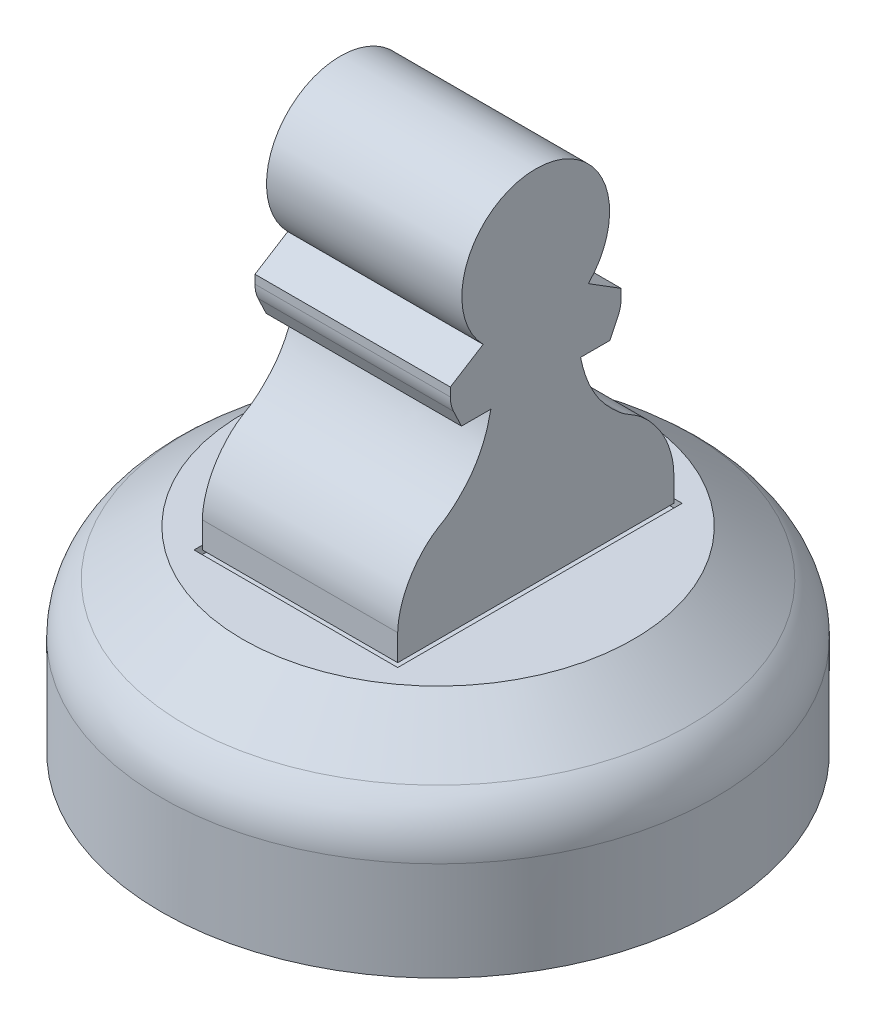
ISO-10303-21;
HEADER;
FILE_DESCRIPTION(('STEP AP214'),'2;1');
FILE_NAME('part.step','',(''),(''),'','','');
FILE_SCHEMA(('AUTOMOTIVE_DESIGN { 1 0 10303 214 1 1 1 1 }'));
ENDSEC;
DATA;
#1=APPLICATION_CONTEXT('core data for automotive mechanical design processes');
#2=APPLICATION_PROTOCOL_DEFINITION('international standard','automotive_design',2000,#1);
#3=PRODUCT_CONTEXT('',#1,'mechanical');
#4=PRODUCT('Part','Part','',(#3));
#5=PRODUCT_RELATED_PRODUCT_CATEGORY('part','',(#4));
#6=PRODUCT_DEFINITION_FORMATION('','',#4);
#7=PRODUCT_DEFINITION_CONTEXT('part definition',#1,'design');
#8=PRODUCT_DEFINITION('design','',#6,#7);
#9=PRODUCT_DEFINITION_SHAPE('','',#8);
#10=(LENGTH_UNIT() NAMED_UNIT(*) SI_UNIT(.MILLI.,.METRE.));
#11=(NAMED_UNIT(*) PLANE_ANGLE_UNIT() SI_UNIT($,.RADIAN.));
#12=(NAMED_UNIT(*) SI_UNIT($,.STERADIAN.) SOLID_ANGLE_UNIT());
#13=UNCERTAINTY_MEASURE_WITH_UNIT(LENGTH_MEASURE(1.E-05),#10,'distance_accuracy_value','');
#14=(GEOMETRIC_REPRESENTATION_CONTEXT(3) GLOBAL_UNCERTAINTY_ASSIGNED_CONTEXT((#13)) GLOBAL_UNIT_ASSIGNED_CONTEXT((#10,
#11,#12)) REPRESENTATION_CONTEXT('',''));
#15=CARTESIAN_POINT('',(0.,0.,0.));
#16=DIRECTION('',(0.,0.,1.));
#17=DIRECTION('',(1.,0.,0.));
#18=AXIS2_PLACEMENT_3D('',#15,#16,#17);
#19=CARTESIAN_POINT('',(4.7625,9.525,6.731));
#20=DIRECTION('',(0.,0.,-1.));
#21=DIRECTION('',(-1.,0.,0.));
#22=AXIS2_PLACEMENT_3D('',#19,#20,#21);
#23=PLANE('',#22);
#24=DIRECTION('',(0.,-1.,0.));
#25=VECTOR('',#24,1.);
#26=CARTESIAN_POINT('',(-4.7625,9.525,6.731));
#27=LINE('',#26,#25);
#28=CARTESIAN_POINT('',(-4.7625,10.795,6.731));
#29=VERTEX_POINT('',#28);
#30=CARTESIAN_POINT('',(-4.7625,9.525,6.731));
#31=VERTEX_POINT('',#30);
#32=EDGE_CURVE('E183',#29,#31,#27,.T.);
#33=ORIENTED_EDGE('',*,*,#32,.T.);
#34=DIRECTION('',(-1.,0.,0.));
#35=VECTOR('',#34,1.);
#36=CARTESIAN_POINT('',(4.7625,9.525,6.731));
#37=LINE('',#36,#35);
#38=CARTESIAN_POINT('',(4.7625,9.525,6.731));
#39=VERTEX_POINT('',#38);
#40=EDGE_CURVE('E164',#39,#31,#37,.T.);
#41=ORIENTED_EDGE('',*,*,#40,.F.);
#42=DIRECTION('',(0.,-1.,0.));
#43=VECTOR('',#42,1.);
#44=CARTESIAN_POINT('',(4.7625,9.525,6.731));
#45=LINE('',#44,#43);
#46=CARTESIAN_POINT('',(4.7625,10.795,6.731));
#47=VERTEX_POINT('',#46);
#48=EDGE_CURVE('E170',#47,#39,#45,.T.);
#49=ORIENTED_EDGE('',*,*,#48,.F.);
#50=DIRECTION('',(-1.,0.,0.));
#51=VECTOR('',#50,1.);
#52=CARTESIAN_POINT('',(4.7625,10.795,6.731));
#53=LINE('',#52,#51);
#54=EDGE_CURVE('E227',#47,#29,#53,.T.);
#55=ORIENTED_EDGE('',*,*,#54,.T.);
#56=EDGE_LOOP('',(#33,#41,#49,#55));
#57=FACE_BOUND('',#56,.T.);
#58=ADVANCED_FACE('F47',(#57),#23,.F.);
#59=CARTESIAN_POINT('',(4.7625,9.525,6.731));
#60=DIRECTION('',(0.,1.,0.));
#61=DIRECTION('',(0.,0.,1.));
#62=AXIS2_PLACEMENT_3D('',#59,#60,#61);
#63=PLANE('',#62);
#64=DIRECTION('',(0.,0.,-1.));
#65=VECTOR('',#64,1.);
#66=CARTESIAN_POINT('',(-4.7625,9.525,6.731));
#67=LINE('',#66,#65);
#68=CARTESIAN_POINT('',(-4.7625,9.525,-6.731));
#69=VERTEX_POINT('',#68);
#70=EDGE_CURVE('E272',#31,#69,#67,.T.);
#71=ORIENTED_EDGE('',*,*,#70,.T.);
#72=DIRECTION('',(-1.,0.,0.));
#73=VECTOR('',#72,1.);
#74=CARTESIAN_POINT('',(4.7625,9.525,-6.731));
#75=LINE('',#74,#73);
#76=CARTESIAN_POINT('',(4.7625,9.525,-6.731));
#77=VERTEX_POINT('',#76);
#78=EDGE_CURVE('E167',#77,#69,#75,.T.);
#79=ORIENTED_EDGE('',*,*,#78,.F.);
#80=DIRECTION('',(0.,0.,-1.));
#81=VECTOR('',#80,1.);
#82=CARTESIAN_POINT('',(4.7625,9.525,6.731));
#83=LINE('',#82,#81);
#84=EDGE_CURVE('E160',#39,#77,#83,.T.);
#85=ORIENTED_EDGE('',*,*,#84,.F.);
#86=ORIENTED_EDGE('',*,*,#40,.T.);
#87=EDGE_LOOP('',(#71,#79,#85,#86));
#88=FACE_BOUND('',#87,.T.);
#89=ADVANCED_FACE('F162',(#88),#63,.F.);
#90=CARTESIAN_POINT('',(4.7625,9.525,-6.731));
#91=DIRECTION('',(0.,0.,1.));
#92=DIRECTION('',(1.,0.,0.));
#93=AXIS2_PLACEMENT_3D('',#90,#91,#92);
#94=PLANE('',#93);
#95=DIRECTION('',(0.,1.,0.));
#96=VECTOR('',#95,1.);
#97=CARTESIAN_POINT('',(-4.7625,9.525,-6.731));
#98=LINE('',#97,#96);
#99=CARTESIAN_POINT('',(-4.7625,10.795,-6.731));
#100=VERTEX_POINT('',#99);
#101=EDGE_CURVE('E266',#69,#100,#98,.T.);
#102=ORIENTED_EDGE('',*,*,#101,.T.);
#103=DIRECTION('',(-1.,0.,0.));
#104=VECTOR('',#103,1.);
#105=CARTESIAN_POINT('',(4.7625,10.795,-6.731));
#106=LINE('',#105,#104);
#107=CARTESIAN_POINT('',(4.7625,10.795,-6.731));
#108=VERTEX_POINT('',#107);
#109=EDGE_CURVE('E189',#108,#100,#106,.T.);
#110=ORIENTED_EDGE('',*,*,#109,.F.);
#111=DIRECTION('',(0.,1.,0.));
#112=VECTOR('',#111,1.);
#113=CARTESIAN_POINT('',(4.7625,9.525,-6.731));
#114=LINE('',#113,#112);
#115=EDGE_CURVE('E169',#77,#108,#114,.T.);
#116=ORIENTED_EDGE('',*,*,#115,.F.);
#117=ORIENTED_EDGE('',*,*,#78,.T.);
#118=EDGE_LOOP('',(#102,#110,#116,#117));
#119=FACE_BOUND('',#118,.T.);
#120=ADVANCED_FACE('F353',(#119),#94,.F.);
#121=CARTESIAN_POINT('',(4.7625,10.795,-6.731));
#122=CARTESIAN_POINT('',(4.7625,11.0241319268793,-6.731));
#123=CARTESIAN_POINT('',(4.7625,11.6026874611906,-6.64960612664507));
#124=CARTESIAN_POINT('',(4.7625,12.4706472582263,-6.35813117453108));
#125=CARTESIAN_POINT('',(4.7625,13.3301451794058,-5.80840860481326));
#126=CARTESIAN_POINT('',(4.7625,13.9301633771704,-5.23255324055301));
#127=CARTESIAN_POINT('',(4.7625,14.2671935066349,-4.73562192455966));
#128=CARTESIAN_POINT('',(4.7625,14.4669731061236,-4.36587594436598));
#129=CARTESIAN_POINT('',(4.7625,14.7635423092739,-3.99120816735));
#130=CARTESIAN_POINT('',(4.7625,15.1524052456358,-3.58560832337421));
#131=CARTESIAN_POINT('',(4.7625,15.6210459586736,-3.16772687320739));
#132=CARTESIAN_POINT('',(4.7625,16.138033377056,-2.83552458023219));
#133=CARTESIAN_POINT('',(4.7625,16.9097644676274,-2.44918747956017));
#134=CARTESIAN_POINT('',(4.7625,17.5317353579022,-2.2731838727057));
#135=CARTESIAN_POINT('',(4.7625,17.959882493164,-2.18521627206356));
#136=B_SPLINE_CURVE_WITH_KNOTS('',3,(#121,#122,#123,#124,#125,#126,#127,#128,#129,#130,#131,
#132,#133,#134,#135),.UNSPECIFIED.,.F.,.F.,(4,1,1,1,1,1,1,1,1,1,1,1,4),(0.,0.0781794203305404,
0.198071140705867,0.30964197025263,0.424067637434609,0.479109807675531,0.514035466320368,
0.567359704278794,0.641472424946778,0.705863071006986,0.781200871805529,0.850497950222123,1.),.UNSPECIFIED.);
#137=DIRECTION('',(-1.,0.,0.));
#138=VECTOR('',#137,1.);
#139=SURFACE_OF_LINEAR_EXTRUSION('',#136,#138);
#140=CARTESIAN_POINT('',(-4.7625,10.795,-6.731));
#141=CARTESIAN_POINT('',(-4.7625,11.0241319268793,-6.731));
#142=CARTESIAN_POINT('',(-4.7625,11.6026874611906,-6.64960612664507));
#143=CARTESIAN_POINT('',(-4.7625,12.4706472582263,-6.35813117453108));
#144=CARTESIAN_POINT('',(-4.7625,13.3301451794058,-5.80840860481326));
#145=CARTESIAN_POINT('',(-4.7625,13.9301633771704,-5.23255324055301));
#146=CARTESIAN_POINT('',(-4.7625,14.2671935066349,-4.73562192455966));
#147=CARTESIAN_POINT('',(-4.7625,14.4669731061236,-4.36587594436598));
#148=CARTESIAN_POINT('',(-4.7625,14.7635423092739,-3.99120816735));
#149=CARTESIAN_POINT('',(-4.7625,15.1524052456358,-3.58560832337421));
#150=CARTESIAN_POINT('',(-4.7625,15.6210459586736,-3.16772687320739));
#151=CARTESIAN_POINT('',(-4.7625,16.138033377056,-2.83552458023219));
#152=CARTESIAN_POINT('',(-4.7625,16.9097644676274,-2.44918747956017));
#153=CARTESIAN_POINT('',(-4.7625,17.5317353579022,-2.2731838727057));
#154=CARTESIAN_POINT('',(-4.7625,17.959882493164,-2.18521627206356));
#155=B_SPLINE_CURVE_WITH_KNOTS('',3,(#140,#141,#142,#143,#144,#145,#146,#147,#148,#149,#150,
#151,#152,#153,#154),.UNSPECIFIED.,.F.,.F.,(4,1,1,1,1,1,1,1,1,1,1,1,4),(0.,0.0781794203305404,
0.198071140705867,0.30964197025263,0.424067637434609,0.479109807675531,0.514035466320368,
0.567359704278794,0.641472424946778,0.705863071006986,0.781200871805529,0.850497950222123,1.),.UNSPECIFIED.);
#156=CARTESIAN_POINT('',(-4.7625,17.959882493164,-2.18521627206356));
#157=VERTEX_POINT('',#156);
#158=EDGE_CURVE('E261',#100,#157,#155,.T.);
#159=ORIENTED_EDGE('',*,*,#158,.T.);
#160=DIRECTION('',(-1.,0.,0.));
#161=VECTOR('',#160,1.);
#162=CARTESIAN_POINT('',(4.7625,17.959882493164,-2.18521627206356));
#163=LINE('',#162,#161);
#164=CARTESIAN_POINT('',(4.7625,17.959882493164,-2.18521627206356));
#165=VERTEX_POINT('',#164);
#166=EDGE_CURVE('E252',#165,#157,#163,.T.);
#167=ORIENTED_EDGE('',*,*,#166,.F.);
#168=EDGE_CURVE('E262',#108,#165,#136,.T.);
#169=ORIENTED_EDGE('',*,*,#168,.F.);
#170=ORIENTED_EDGE('',*,*,#109,.T.);
#171=EDGE_LOOP('',(#159,#167,#169,#170));
#172=FACE_BOUND('',#171,.T.);
#173=ADVANCED_FACE('F259',(#172),#139,.F.);
#174=CARTESIAN_POINT('',(4.7625,17.959882493164,-2.18521627206356));
#175=DIRECTION('',(0.,1.,0.));
#176=DIRECTION('',(0.,0.,1.));
#177=AXIS2_PLACEMENT_3D('',#174,#175,#176);
#178=PLANE('',#177);
#179=DIRECTION('',(0.,0.,-1.));
#180=VECTOR('',#179,1.);
#181=CARTESIAN_POINT('',(-4.7625,17.959882493164,-2.18521627206356));
#182=LINE('',#181,#180);
#183=CARTESIAN_POINT('',(-4.7625,17.959882493164,-3.6207595466449));
#184=VERTEX_POINT('',#183);
#185=EDGE_CURVE('E268',#157,#184,#182,.T.);
#186=ORIENTED_EDGE('',*,*,#185,.T.);
#187=DIRECTION('',(-1.,0.,0.));
#188=VECTOR('',#187,1.);
#189=CARTESIAN_POINT('',(4.7625,17.959882493164,-3.6207595466449));
#190=LINE('',#189,#188);
#191=CARTESIAN_POINT('',(4.7625,17.959882493164,-3.6207595466449));
#192=VERTEX_POINT('',#191);
#193=EDGE_CURVE('E249',#192,#184,#190,.T.);
#194=ORIENTED_EDGE('',*,*,#193,.F.);
#195=DIRECTION('',(0.,0.,-1.));
#196=VECTOR('',#195,1.);
#197=CARTESIAN_POINT('',(4.7625,17.959882493164,-2.18521627206356));
#198=LINE('',#197,#196);
#199=EDGE_CURVE('E360',#165,#192,#198,.T.);
#200=ORIENTED_EDGE('',*,*,#199,.F.);
#201=ORIENTED_EDGE('',*,*,#166,.T.);
#202=EDGE_LOOP('',(#186,#194,#200,#201));
#203=FACE_BOUND('',#202,.T.);
#204=ADVANCED_FACE('F345',(#203),#178,.F.);
#205=CARTESIAN_POINT('',(4.7625,17.959882493164,-3.6207595466449));
#206=DIRECTION('',(0.,0.428528572308294,0.90352823017071));
#207=DIRECTION('',(0.,-0.90352823017071,0.428528572308294));
#208=AXIS2_PLACEMENT_3D('',#205,#206,#207);
#209=PLANE('',#208);
#210=DIRECTION('',(0.,0.90352823017071,-0.428528572308294));
#211=VECTOR('',#210,1.);
#212=CARTESIAN_POINT('',(-4.7625,17.959882493164,-3.6207595466449));
#213=LINE('',#212,#211);
#214=CARTESIAN_POINT('',(-4.7625,18.7839681348446,-4.01160980643419));
#215=VERTEX_POINT('',#214);
#216=EDGE_CURVE('E270',#184,#215,#213,.T.);
#217=ORIENTED_EDGE('',*,*,#216,.T.);
#218=DIRECTION('',(-1.,0.,0.));
#219=VECTOR('',#218,1.);
#220=CARTESIAN_POINT('',(4.7625,18.7839681348446,-4.01160980643419));
#221=LINE('',#220,#219);
#222=CARTESIAN_POINT('',(4.7625,18.7839681348446,-4.01160980643419));
#223=VERTEX_POINT('',#222);
#224=EDGE_CURVE('E196',#215,#223,#221,.F.);
#225=ORIENTED_EDGE('',*,*,#224,.T.);
#226=DIRECTION('',(0.,0.90352823017071,-0.428528572308294));
#227=VECTOR('',#226,1.);
#228=CARTESIAN_POINT('',(4.7625,17.959882493164,-3.6207595466449));
#229=LINE('',#228,#227);
#230=EDGE_CURVE('E365',#192,#223,#229,.T.);
#231=ORIENTED_EDGE('',*,*,#230,.F.);
#232=ORIENTED_EDGE('',*,*,#193,.T.);
#233=EDGE_LOOP('',(#217,#225,#231,#232));
#234=FACE_BOUND('',#233,.T.);
#235=ADVANCED_FACE('F341',(#234),#209,.F.);
#236=CARTESIAN_POINT('',(4.7625,19.1068739917165,-4.16475874103819));
#237=DIRECTION('',(0.,0.,1.));
#238=DIRECTION('',(1.,0.,0.));
#239=AXIS2_PLACEMENT_3D('',#236,#237,#238);
#240=PLANE('',#239);
#241=DIRECTION('',(0.,1.,0.));
#242=VECTOR('',#241,1.);
#243=CARTESIAN_POINT('',(4.7625,19.1068739917165,-4.16475874103819));
#244=LINE('',#243,#242);
#245=CARTESIAN_POINT('',(4.7625,19.4642572433841,-4.16475874103819));
#246=VERTEX_POINT('',#245);
#247=CARTESIAN_POINT('',(4.7625,19.8840341814102,-4.16475874103819));
#248=VERTEX_POINT('',#247);
#249=EDGE_CURVE('E367',#246,#248,#244,.T.);
#250=ORIENTED_EDGE('',*,*,#249,.F.);
#251=DIRECTION('',(-1.,0.,0.));
#252=VECTOR('',#251,1.);
#253=CARTESIAN_POINT('',(4.7625,19.4642572433841,-4.16475874103819));
#254=LINE('',#253,#252);
#255=CARTESIAN_POINT('',(-4.7625,19.4642572433841,-4.16475874103819));
#256=VERTEX_POINT('',#255);
#257=EDGE_CURVE('E184',#246,#256,#254,.T.);
#258=ORIENTED_EDGE('',*,*,#257,.T.);
#259=DIRECTION('',(0.,1.,0.));
#260=VECTOR('',#259,1.);
#261=CARTESIAN_POINT('',(-4.7625,19.1068739917165,-4.16475874103819));
#262=LINE('',#261,#260);
#263=CARTESIAN_POINT('',(-4.7625,19.8840341814102,-4.16475874103819));
#264=VERTEX_POINT('',#263);
#265=EDGE_CURVE('E283',#256,#264,#262,.T.);
#266=ORIENTED_EDGE('',*,*,#265,.T.);
#267=DIRECTION('',(-1.,0.,0.));
#268=VECTOR('',#267,1.);
#269=CARTESIAN_POINT('',(4.7625,19.8840341814102,-4.16475874103819));
#270=LINE('',#269,#268);
#271=EDGE_CURVE('E246',#248,#264,#270,.T.);
#272=ORIENTED_EDGE('',*,*,#271,.F.);
#273=EDGE_LOOP('',(#250,#258,#266,#272));
#274=FACE_BOUND('',#273,.T.);
#275=ADVANCED_FACE('F337',(#274),#240,.F.);
#276=CARTESIAN_POINT('',(4.7625,19.8840341814102,-4.16475874103819));
#277=DIRECTION('',(0.,-0.847610316453785,0.530619215107326));
#278=DIRECTION('',(0.,-0.530619215107326,-0.847610316453785));
#279=AXIS2_PLACEMENT_3D('',#276,#277,#278);
#280=PLANE('',#279);
#281=DIRECTION('',(0.,0.530619215107325,0.847610316453785));
#282=VECTOR('',#281,1.);
#283=CARTESIAN_POINT('',(-4.7625,19.8840341814102,-4.16475874103819));
#284=LINE('',#283,#282);
#285=CARTESIAN_POINT('',(-4.7625,20.8850698421642,-2.56570591928617));
#286=VERTEX_POINT('',#285);
#287=EDGE_CURVE('E285',#264,#286,#284,.T.);
#288=ORIENTED_EDGE('',*,*,#287,.T.);
#289=DIRECTION('',(-1.,0.,0.));
#290=VECTOR('',#289,1.);
#291=CARTESIAN_POINT('',(4.7625,20.8850698421642,-2.56570591928617));
#292=LINE('',#291,#290);
#293=CARTESIAN_POINT('',(4.7625,20.8850698421642,-2.56570591928617));
#294=VERTEX_POINT('',#293);
#295=EDGE_CURVE('E243',#294,#286,#292,.T.);
#296=ORIENTED_EDGE('',*,*,#295,.F.);
#297=DIRECTION('',(0.,0.530619215107325,0.847610316453785));
#298=VECTOR('',#297,1.);
#299=CARTESIAN_POINT('',(4.7625,19.8840341814102,-4.16475874103819));
#300=LINE('',#299,#298);
#301=EDGE_CURVE('E369',#248,#294,#300,.T.);
#302=ORIENTED_EDGE('',*,*,#301,.F.);
#303=ORIENTED_EDGE('',*,*,#271,.T.);
#304=EDGE_LOOP('',(#288,#296,#302,#303));
#305=FACE_BOUND('',#304,.T.);
#306=ADVANCED_FACE('F333',(#305),#280,.F.);
#307=CARTESIAN_POINT('',(4.7625,23.4136449680045,0.));
#308=DIRECTION('',(-1.,0.,0.));
#309=DIRECTION('',(0.,0.,1.));
#310=AXIS2_PLACEMENT_3D('',#307,#308,#309);
#311=CYLINDRICAL_SURFACE('',#310,3.60229635528204);
#312=CARTESIAN_POINT('',(-4.7625,23.4136449680045,0.));
#313=DIRECTION('',(1.,0.,0.));
#314=DIRECTION('',(0.,0.,1.));
#315=AXIS2_PLACEMENT_3D('',#312,#313,#314);
#316=CIRCLE('',#315,3.60229635528204);
#317=CARTESIAN_POINT('',(-4.7625,20.8850698421642,2.56570591928617));
#318=VERTEX_POINT('',#317);
#319=EDGE_CURVE('E287',#286,#318,#316,.T.);
#320=ORIENTED_EDGE('',*,*,#319,.T.);
#321=DIRECTION('',(-1.,0.,0.));
#322=VECTOR('',#321,1.);
#323=CARTESIAN_POINT('',(4.7625,20.8850698421642,2.56570591928617));
#324=LINE('',#323,#322);
#325=CARTESIAN_POINT('',(4.7625,20.8850698421642,2.56570591928617));
#326=VERTEX_POINT('',#325);
#327=EDGE_CURVE('E240',#326,#318,#324,.T.);
#328=ORIENTED_EDGE('',*,*,#327,.F.);
#329=CARTESIAN_POINT('',(4.7625,23.4136449680045,0.));
#330=DIRECTION('',(1.,0.,0.));
#331=DIRECTION('',(0.,0.,1.));
#332=AXIS2_PLACEMENT_3D('',#329,#330,#331);
#333=CIRCLE('',#332,3.60229635528204);
#334=EDGE_CURVE('E301',#294,#326,#333,.T.);
#335=ORIENTED_EDGE('',*,*,#334,.F.);
#336=ORIENTED_EDGE('',*,*,#295,.T.);
#337=EDGE_LOOP('',(#320,#328,#335,#336));
#338=FACE_BOUND('',#337,.T.);
#339=ADVANCED_FACE('F330',(#338),#311,.T.);
#340=CARTESIAN_POINT('',(4.7625,19.8840341814102,4.16475874103819));
#341=DIRECTION('',(0.,-0.847610316453785,-0.530619215107326));
#342=DIRECTION('',(0.,0.530619215107326,-0.847610316453785));
#343=AXIS2_PLACEMENT_3D('',#340,#341,#342);
#344=PLANE('',#343);
#345=DIRECTION('',(0.,-0.530619215107325,0.847610316453785));
#346=VECTOR('',#345,1.);
#347=CARTESIAN_POINT('',(-4.7625,19.8840341814102,4.16475874103819));
#348=LINE('',#347,#346);
#349=CARTESIAN_POINT('',(-4.7625,19.8840341814102,4.16475874103819));
#350=VERTEX_POINT('',#349);
#351=EDGE_CURVE('E220',#318,#350,#348,.T.);
#352=ORIENTED_EDGE('',*,*,#351,.T.);
#353=DIRECTION('',(-1.,0.,0.));
#354=VECTOR('',#353,1.);
#355=CARTESIAN_POINT('',(4.7625,19.8840341814102,4.16475874103819));
#356=LINE('',#355,#354);
#357=CARTESIAN_POINT('',(4.7625,19.8840341814102,4.16475874103819));
#358=VERTEX_POINT('',#357);
#359=EDGE_CURVE('E237',#358,#350,#356,.T.);
#360=ORIENTED_EDGE('',*,*,#359,.F.);
#361=DIRECTION('',(0.,-0.530619215107325,0.847610316453785));
#362=VECTOR('',#361,1.);
#363=CARTESIAN_POINT('',(4.7625,19.8840341814102,4.16475874103819));
#364=LINE('',#363,#362);
#365=EDGE_CURVE('E297',#326,#358,#364,.T.);
#366=ORIENTED_EDGE('',*,*,#365,.F.);
#367=ORIENTED_EDGE('',*,*,#327,.T.);
#368=EDGE_LOOP('',(#352,#360,#366,#367));
#369=FACE_BOUND('',#368,.T.);
#370=ADVANCED_FACE('F291',(#369),#344,.F.);
#371=CARTESIAN_POINT('',(4.7625,19.1068739917165,4.16475874103819));
#372=DIRECTION('',(0.,0.,-1.));
#373=DIRECTION('',(-1.,0.,0.));
#374=AXIS2_PLACEMENT_3D('',#371,#372,#373);
#375=PLANE('',#374);
#376=DIRECTION('',(0.,-1.,0.));
#377=VECTOR('',#376,1.);
#378=CARTESIAN_POINT('',(-4.7625,19.1068739917165,4.16475874103819));
#379=LINE('',#378,#377);
#380=CARTESIAN_POINT('',(-4.7625,19.4642572433841,4.16475874103819));
#381=VERTEX_POINT('',#380);
#382=EDGE_CURVE('E217',#350,#381,#379,.T.);
#383=ORIENTED_EDGE('',*,*,#382,.T.);
#384=DIRECTION('',(-1.,0.,0.));
#385=VECTOR('',#384,1.);
#386=CARTESIAN_POINT('',(4.7625,19.4642572433841,4.16475874103819));
#387=LINE('',#386,#385);
#388=CARTESIAN_POINT('',(4.7625,19.4642572433841,4.16475874103819));
#389=VERTEX_POINT('',#388);
#390=EDGE_CURVE('E12',#381,#389,#387,.F.);
#391=ORIENTED_EDGE('',*,*,#390,.T.);
#392=DIRECTION('',(0.,-1.,0.));
#393=VECTOR('',#392,1.);
#394=CARTESIAN_POINT('',(4.7625,19.1068739917165,4.16475874103819));
#395=LINE('',#394,#393);
#396=EDGE_CURVE('E296',#358,#389,#395,.T.);
#397=ORIENTED_EDGE('',*,*,#396,.F.);
#398=ORIENTED_EDGE('',*,*,#359,.T.);
#399=EDGE_LOOP('',(#383,#391,#397,#398));
#400=FACE_BOUND('',#399,.T.);
#401=ADVANCED_FACE('F295',(#400),#375,.F.);
#402=CARTESIAN_POINT('',(4.7625,17.959882493164,3.6207595466449));
#403=DIRECTION('',(0.,0.428528572308294,-0.90352823017071));
#404=DIRECTION('',(0.,0.90352823017071,0.428528572308294));
#405=AXIS2_PLACEMENT_3D('',#402,#403,#404);
#406=PLANE('',#405);
#407=DIRECTION('',(0.,-0.90352823017071,-0.428528572308294));
#408=VECTOR('',#407,1.);
#409=CARTESIAN_POINT('',(4.7625,17.959882493164,3.6207595466449));
#410=LINE('',#409,#408);
#411=CARTESIAN_POINT('',(4.7625,18.7839681348446,4.01160980643419));
#412=VERTEX_POINT('',#411);
#413=CARTESIAN_POINT('',(4.7625,17.959882493164,3.6207595466449));
#414=VERTEX_POINT('',#413);
#415=EDGE_CURVE('E208',#412,#414,#410,.T.);
#416=ORIENTED_EDGE('',*,*,#415,.F.);
#417=DIRECTION('',(-1.,0.,0.));
#418=VECTOR('',#417,1.);
#419=CARTESIAN_POINT('',(4.7625,18.7839681348446,4.01160980643419));
#420=LINE('',#419,#418);
#421=CARTESIAN_POINT('',(-4.7625,18.7839681348446,4.01160980643419));
#422=VERTEX_POINT('',#421);
#423=EDGE_CURVE('E55',#412,#422,#420,.T.);
#424=ORIENTED_EDGE('',*,*,#423,.T.);
#425=DIRECTION('',(0.,-0.90352823017071,-0.428528572308294));
#426=VECTOR('',#425,1.);
#427=CARTESIAN_POINT('',(-4.7625,17.959882493164,3.6207595466449));
#428=LINE('',#427,#426);
#429=CARTESIAN_POINT('',(-4.7625,17.959882493164,3.6207595466449));
#430=VERTEX_POINT('',#429);
#431=EDGE_CURVE('E206',#422,#430,#428,.T.);
#432=ORIENTED_EDGE('',*,*,#431,.T.);
#433=DIRECTION('',(-1.,0.,0.));
#434=VECTOR('',#433,1.);
#435=CARTESIAN_POINT('',(4.7625,17.959882493164,3.6207595466449));
#436=LINE('',#435,#434);
#437=EDGE_CURVE('E235',#414,#430,#436,.T.);
#438=ORIENTED_EDGE('',*,*,#437,.F.);
#439=EDGE_LOOP('',(#416,#424,#432,#438));
#440=FACE_BOUND('',#439,.T.);
#441=ADVANCED_FACE('F204',(#440),#406,.F.);
#442=CARTESIAN_POINT('',(4.7625,17.959882493164,2.18521627206356));
#443=DIRECTION('',(0.,1.,0.));
#444=DIRECTION('',(0.,0.,1.));
#445=AXIS2_PLACEMENT_3D('',#442,#443,#444);
#446=PLANE('',#445);
#447=DIRECTION('',(0.,0.,-1.));
#448=VECTOR('',#447,1.);
#449=CARTESIAN_POINT('',(-4.7625,17.959882493164,2.18521627206356));
#450=LINE('',#449,#448);
#451=CARTESIAN_POINT('',(-4.7625,17.959882493164,2.18521627206356));
#452=VERTEX_POINT('',#451);
#453=EDGE_CURVE('E216',#430,#452,#450,.T.);
#454=ORIENTED_EDGE('',*,*,#453,.T.);
#455=DIRECTION('',(-1.,0.,0.));
#456=VECTOR('',#455,1.);
#457=CARTESIAN_POINT('',(4.7625,17.959882493164,2.18521627206356));
#458=LINE('',#457,#456);
#459=CARTESIAN_POINT('',(4.7625,17.959882493164,2.18521627206356));
#460=VERTEX_POINT('',#459);
#461=EDGE_CURVE('E232',#460,#452,#458,.T.);
#462=ORIENTED_EDGE('',*,*,#461,.F.);
#463=DIRECTION('',(0.,0.,-1.));
#464=VECTOR('',#463,1.);
#465=CARTESIAN_POINT('',(4.7625,17.959882493164,2.18521627206356));
#466=LINE('',#465,#464);
#467=EDGE_CURVE('E299',#414,#460,#466,.T.);
#468=ORIENTED_EDGE('',*,*,#467,.F.);
#469=ORIENTED_EDGE('',*,*,#437,.T.);
#470=EDGE_LOOP('',(#454,#462,#468,#469));
#471=FACE_BOUND('',#470,.T.);
#472=ADVANCED_FACE('F318',(#471),#446,.F.);
#473=CARTESIAN_POINT('',(4.7625,17.959882493164,2.18521627206356));
#474=CARTESIAN_POINT('',(4.7625,17.5317353579022,2.2731838727057));
#475=CARTESIAN_POINT('',(4.7625,16.9097644676274,2.44918747956017));
#476=CARTESIAN_POINT('',(4.7625,16.138033377056,2.83552458023219));
#477=CARTESIAN_POINT('',(4.7625,15.6210459586736,3.16772687320739));
#478=CARTESIAN_POINT('',(4.7625,15.1524052456358,3.58560832337421));
#479=CARTESIAN_POINT('',(4.7625,14.7635423092739,3.99120816735));
#480=CARTESIAN_POINT('',(4.7625,14.4669731061236,4.36587594436598));
#481=CARTESIAN_POINT('',(4.7625,14.2671935066349,4.73562192455966));
#482=CARTESIAN_POINT('',(4.7625,13.9301633771704,5.23255324055301));
#483=CARTESIAN_POINT('',(4.7625,13.3301451794058,5.80840860481326));
#484=CARTESIAN_POINT('',(4.7625,12.4706472582263,6.35813117453108));
#485=CARTESIAN_POINT('',(4.7625,11.6026874611906,6.64960612664507));
#486=CARTESIAN_POINT('',(4.7625,11.0241319268793,6.731));
#487=CARTESIAN_POINT('',(4.7625,10.795,6.731));
#488=B_SPLINE_CURVE_WITH_KNOTS('',3,(#473,#474,#475,#476,#477,#478,#479,#480,#481,#482,#483,
#484,#485,#486,#487),.UNSPECIFIED.,.F.,.F.,(4,1,1,1,1,1,1,1,1,1,1,1,4),(0.,0.149502049777877,
0.218799128194471,0.294136928993014,0.358527575053222,0.432640295721206,0.485964533679632,
0.520890192324469,0.57593236256539,0.69035802974737,0.801928859294133,0.92182057966946,1.),.UNSPECIFIED.);
#489=DIRECTION('',(-1.,0.,0.));
#490=VECTOR('',#489,1.);
#491=SURFACE_OF_LINEAR_EXTRUSION('',#488,#490);
#492=CARTESIAN_POINT('',(-4.7625,17.959882493164,2.18521627206356));
#493=CARTESIAN_POINT('',(-4.7625,17.5317353579022,2.2731838727057));
#494=CARTESIAN_POINT('',(-4.7625,16.9097644676274,2.44918747956017));
#495=CARTESIAN_POINT('',(-4.7625,16.138033377056,2.83552458023219));
#496=CARTESIAN_POINT('',(-4.7625,15.6210459586736,3.16772687320739));
#497=CARTESIAN_POINT('',(-4.7625,15.1524052456358,3.58560832337421));
#498=CARTESIAN_POINT('',(-4.7625,14.7635423092739,3.99120816735));
#499=CARTESIAN_POINT('',(-4.7625,14.4669731061236,4.36587594436598));
#500=CARTESIAN_POINT('',(-4.7625,14.2671935066349,4.73562192455966));
#501=CARTESIAN_POINT('',(-4.7625,13.9301633771704,5.23255324055301));
#502=CARTESIAN_POINT('',(-4.7625,13.3301451794058,5.80840860481326));
#503=CARTESIAN_POINT('',(-4.7625,12.4706472582263,6.35813117453108));
#504=CARTESIAN_POINT('',(-4.7625,11.6026874611906,6.64960612664507));
#505=CARTESIAN_POINT('',(-4.7625,11.0241319268793,6.731));
#506=CARTESIAN_POINT('',(-4.7625,10.795,6.731));
#507=B_SPLINE_CURVE_WITH_KNOTS('',3,(#492,#493,#494,#495,#496,#497,#498,#499,#500,#501,#502,
#503,#504,#505,#506),.UNSPECIFIED.,.F.,.F.,(4,1,1,1,1,1,1,1,1,1,1,1,4),(0.,0.149502049777877,
0.218799128194471,0.294136928993014,0.358527575053222,0.432640295721206,0.485964533679632,
0.520890192324469,0.57593236256539,0.69035802974737,0.801928859294133,0.92182057966946,1.),.UNSPECIFIED.);
#508=EDGE_CURVE('E180',#452,#29,#507,.T.);
#509=ORIENTED_EDGE('',*,*,#508,.T.);
#510=ORIENTED_EDGE('',*,*,#54,.F.);
#511=EDGE_CURVE('E176',#460,#47,#488,.T.);
#512=ORIENTED_EDGE('',*,*,#511,.F.);
#513=ORIENTED_EDGE('',*,*,#461,.T.);
#514=EDGE_LOOP('',(#509,#510,#512,#513));
#515=FACE_BOUND('',#514,.T.);
#516=ADVANCED_FACE('F314',(#515),#491,.F.);
#517=CARTESIAN_POINT('',(4.7625,14.383671045293,4.52267651129988));
#518=DIRECTION('',(1.,0.,0.));
#519=DIRECTION('',(0.,0.,-1.));
#520=AXIS2_PLACEMENT_3D('',#517,#518,#519);
#521=PLANE('',#520);
#522=ORIENTED_EDGE('',*,*,#230,.T.);
#523=CARTESIAN_POINT('',(4.7625,19.4642572433841,-2.57725874103819));
#524=DIRECTION('',(1.,0.,0.));
#525=DIRECTION('',(0.,0.,-1.));
#526=AXIS2_PLACEMENT_3D('',#523,#524,#525);
#527=CIRCLE('',#526,1.5875);
#528=EDGE_CURVE('E199',#223,#246,#527,.T.);
#529=ORIENTED_EDGE('',*,*,#528,.T.);
#530=ORIENTED_EDGE('',*,*,#249,.T.);
#531=ORIENTED_EDGE('',*,*,#301,.T.);
#532=ORIENTED_EDGE('',*,*,#334,.T.);
#533=ORIENTED_EDGE('',*,*,#365,.T.);
#534=ORIENTED_EDGE('',*,*,#396,.T.);
#535=CARTESIAN_POINT('',(4.7625,19.4642572433841,2.57725874103819));
#536=DIRECTION('',(1.,0.,0.));
#537=DIRECTION('',(0.,0.,-1.));
#538=AXIS2_PLACEMENT_3D('',#535,#536,#537);
#539=CIRCLE('',#538,1.5875);
#540=EDGE_CURVE('E62',#389,#412,#539,.T.);
#541=ORIENTED_EDGE('',*,*,#540,.T.);
#542=ORIENTED_EDGE('',*,*,#415,.T.);
#543=ORIENTED_EDGE('',*,*,#467,.T.);
#544=ORIENTED_EDGE('',*,*,#511,.T.);
#545=ORIENTED_EDGE('',*,*,#48,.T.);
#546=ORIENTED_EDGE('',*,*,#84,.T.);
#547=ORIENTED_EDGE('',*,*,#115,.T.);
#548=ORIENTED_EDGE('',*,*,#168,.T.);
#549=ORIENTED_EDGE('',*,*,#199,.T.);
#550=EDGE_LOOP('',(#522,#529,#530,#531,#532,#533,#534,#541,#542,#543,#544,#545,#546,#547,#548,#549));
#551=FACE_BOUND('',#550,.T.);
#552=ADVANCED_FACE('F174',(#551),#521,.T.);
#553=CARTESIAN_POINT('',(-4.7625,14.383671045293,4.52267651129988));
#554=DIRECTION('',(1.,0.,0.));
#555=DIRECTION('',(0.,0.,-1.));
#556=AXIS2_PLACEMENT_3D('',#553,#554,#555);
#557=PLANE('',#556);
#558=ORIENTED_EDGE('',*,*,#265,.F.);
#559=CARTESIAN_POINT('',(-4.7625,19.4642572433841,-2.57725874103819));
#560=DIRECTION('',(1.,0.,0.));
#561=DIRECTION('',(0.,0.,-1.));
#562=AXIS2_PLACEMENT_3D('',#559,#560,#561);
#563=CIRCLE('',#562,1.5875);
#564=EDGE_CURVE('E194',#256,#215,#563,.F.);
#565=ORIENTED_EDGE('',*,*,#564,.T.);
#566=ORIENTED_EDGE('',*,*,#216,.F.);
#567=ORIENTED_EDGE('',*,*,#185,.F.);
#568=ORIENTED_EDGE('',*,*,#158,.F.);
#569=ORIENTED_EDGE('',*,*,#101,.F.);
#570=ORIENTED_EDGE('',*,*,#70,.F.);
#571=ORIENTED_EDGE('',*,*,#32,.F.);
#572=ORIENTED_EDGE('',*,*,#508,.F.);
#573=ORIENTED_EDGE('',*,*,#453,.F.);
#574=ORIENTED_EDGE('',*,*,#431,.F.);
#575=CARTESIAN_POINT('',(-4.7625,19.4642572433841,2.57725874103819));
#576=DIRECTION('',(1.,0.,0.));
#577=DIRECTION('',(0.,0.,-1.));
#578=AXIS2_PLACEMENT_3D('',#575,#576,#577);
#579=CIRCLE('',#578,1.5875);
#580=EDGE_CURVE('E187',#422,#381,#579,.F.);
#581=ORIENTED_EDGE('',*,*,#580,.T.);
#582=ORIENTED_EDGE('',*,*,#382,.F.);
#583=ORIENTED_EDGE('',*,*,#351,.F.);
#584=ORIENTED_EDGE('',*,*,#319,.F.);
#585=ORIENTED_EDGE('',*,*,#287,.F.);
#586=EDGE_LOOP('',(#558,#565,#566,#567,#568,#569,#570,#571,#572,#573,#574,#581,#582,#583,#584,#585));
#587=FACE_BOUND('',#586,.T.);
#588=ADVANCED_FACE('F213',(#587),#557,.F.);
#589=CARTESIAN_POINT('',(4.7625,19.4642572433841,-2.57725874103819));
#590=DIRECTION('',(-1.,0.,0.));
#591=DIRECTION('',(0.,0.,1.));
#592=AXIS2_PLACEMENT_3D('',#589,#590,#591);
#593=CYLINDRICAL_SURFACE('',#592,1.5875);
#594=ORIENTED_EDGE('',*,*,#528,.F.);
#595=ORIENTED_EDGE('',*,*,#224,.F.);
#596=ORIENTED_EDGE('',*,*,#564,.F.);
#597=ORIENTED_EDGE('',*,*,#257,.F.);
#598=EDGE_LOOP('',(#594,#595,#596,#597));
#599=FACE_BOUND('',#598,.T.);
#600=ADVANCED_FACE('F379',(#599),#593,.T.);
#601=CARTESIAN_POINT('',(4.7625,19.4642572433841,2.57725874103819));
#602=DIRECTION('',(-1.,0.,0.));
#603=DIRECTION('',(0.,0.,1.));
#604=AXIS2_PLACEMENT_3D('',#601,#602,#603);
#605=CYLINDRICAL_SURFACE('',#604,1.5875);
#606=ORIENTED_EDGE('',*,*,#540,.F.);
#607=ORIENTED_EDGE('',*,*,#390,.F.);
#608=ORIENTED_EDGE('',*,*,#580,.F.);
#609=ORIENTED_EDGE('',*,*,#423,.F.);
#610=EDGE_LOOP('',(#606,#607,#608,#609));
#611=FACE_BOUND('',#610,.T.);
#612=ADVANCED_FACE('F49',(#611),#605,.T.);
#613=CLOSED_SHELL('',(#58,#89,#120,#173,#204,#235,#275,#306,#339,#370,#401,#441,#472,#516,#552,
#588,#600,#612));
#614=MANIFOLD_SOLID_BREP('B2',#613);
#615=CARTESIAN_POINT('',(0.,6.35,0.));
#616=DIRECTION('',(0.,-1.,0.));
#617=DIRECTION('',(0.,0.,-1.));
#618=AXIS2_PLACEMENT_3D('',#615,#616,#617);
#619=CYLINDRICAL_SURFACE('',#618,13.49375);
#620=CARTESIAN_POINT('',(0.,4.82401610923014,0.));
#621=DIRECTION('',(0.,-1.,0.));
#622=DIRECTION('',(0.,0.,-1.));
#623=AXIS2_PLACEMENT_3D('',#620,#621,#622);
#624=CIRCLE('',#623,13.49375);
#625=CARTESIAN_POINT('',(0.,4.82401610923014,-13.49375));
#626=VERTEX_POINT('',#625);
#627=EDGE_CURVE('E45',#626,#626,#624,.T.);
#628=ORIENTED_EDGE('',*,*,#627,.T.);
#629=EDGE_LOOP('',(#628));
#630=FACE_BOUND('',#629,.T.);
#631=CARTESIAN_POINT('',(0.,0.,0.));
#632=DIRECTION('',(0.,1.,0.));
#633=DIRECTION('',(0.,0.,1.));
#634=AXIS2_PLACEMENT_3D('',#631,#632,#633);
#635=CIRCLE('',#634,13.49375);
#636=CARTESIAN_POINT('',(0.,0.,13.49375));
#637=VERTEX_POINT('',#636);
#638=EDGE_CURVE('E639',#637,#637,#635,.T.);
#639=ORIENTED_EDGE('',*,*,#638,.T.);
#640=EDGE_LOOP('',(#639));
#641=FACE_BOUND('',#640,.T.);
#642=ADVANCED_FACE('F505',(#630,#641),#619,.T.);
#643=CARTESIAN_POINT('',(0.,0.,0.));
#644=DIRECTION('',(0.,1.,0.));
#645=DIRECTION('',(0.,0.,1.));
#646=AXIS2_PLACEMENT_3D('',#643,#644,#645);
#647=PLANE('',#646);
#648=DIRECTION('',(-1.,0.,0.));
#649=VECTOR('',#648,1.);
#650=CARTESIAN_POINT('',(-6.4516,0.,9.6266));
#651=LINE('',#650,#649);
#652=CARTESIAN_POINT('',(6.4516,0.,9.6266));
#653=VERTEX_POINT('',#652);
#654=CARTESIAN_POINT('',(-6.4516,0.,9.6266));
#655=VERTEX_POINT('',#654);
#656=EDGE_CURVE('E629',#653,#655,#651,.T.);
#657=ORIENTED_EDGE('',*,*,#656,.F.);
#658=DIRECTION('',(0.,0.,1.));
#659=VECTOR('',#658,1.);
#660=CARTESIAN_POINT('',(6.4516,0.,-9.6266));
#661=LINE('',#660,#659);
#662=CARTESIAN_POINT('',(6.4516,0.,-9.6266));
#663=VERTEX_POINT('',#662);
#664=EDGE_CURVE('E528',#663,#653,#661,.T.);
#665=ORIENTED_EDGE('',*,*,#664,.F.);
#666=DIRECTION('',(1.,0.,0.));
#667=VECTOR('',#666,1.);
#668=CARTESIAN_POINT('',(-6.4516,0.,-9.6266));
#669=LINE('',#668,#667);
#670=CARTESIAN_POINT('',(-6.4516,0.,-9.6266));
#671=VERTEX_POINT('',#670);
#672=EDGE_CURVE('E618',#671,#663,#669,.T.);
#673=ORIENTED_EDGE('',*,*,#672,.F.);
#674=DIRECTION('',(0.,0.,-1.));
#675=VECTOR('',#674,1.);
#676=CARTESIAN_POINT('',(-6.4516,0.,-9.6266));
#677=LINE('',#676,#675);
#678=EDGE_CURVE('E632',#655,#671,#677,.T.);
#679=ORIENTED_EDGE('',*,*,#678,.F.);
#680=EDGE_LOOP('',(#657,#665,#673,#679));
#681=FACE_BOUND('',#680,.T.);
#682=ORIENTED_EDGE('',*,*,#638,.F.);
#683=EDGE_LOOP('',(#682));
#684=FACE_BOUND('',#683,.T.);
#685=ADVANCED_FACE('F664',(#681,#684),#647,.F.);
#686=CARTESIAN_POINT('',(6.4516,4.7625,-9.6266));
#687=DIRECTION('',(1.,0.,0.));
#688=DIRECTION('',(0.,0.,-1.));
#689=AXIS2_PLACEMENT_3D('',#686,#687,#688);
#690=PLANE('',#689);
#691=ORIENTED_EDGE('',*,*,#664,.T.);
#692=DIRECTION('',(0.,-1.,0.));
#693=VECTOR('',#692,1.);
#694=CARTESIAN_POINT('',(6.4516,4.7625,9.6266));
#695=LINE('',#694,#693);
#696=CARTESIAN_POINT('',(6.4516,4.7625,9.6266));
#697=VERTEX_POINT('',#696);
#698=EDGE_CURVE('E627',#697,#653,#695,.T.);
#699=ORIENTED_EDGE('',*,*,#698,.F.);
#700=DIRECTION('',(0.,0.,1.));
#701=VECTOR('',#700,1.);
#702=CARTESIAN_POINT('',(6.4516,4.7625,-9.6266));
#703=LINE('',#702,#701);
#704=CARTESIAN_POINT('',(6.4516,4.7625,-9.6266));
#705=VERTEX_POINT('',#704);
#706=EDGE_CURVE('E614',#705,#697,#703,.T.);
#707=ORIENTED_EDGE('',*,*,#706,.F.);
#708=DIRECTION('',(0.,-1.,0.));
#709=VECTOR('',#708,1.);
#710=CARTESIAN_POINT('',(6.4516,4.7625,-9.6266));
#711=LINE('',#710,#709);
#712=EDGE_CURVE('E637',#705,#663,#711,.T.);
#713=ORIENTED_EDGE('',*,*,#712,.T.);
#714=EDGE_LOOP('',(#691,#699,#707,#713));
#715=FACE_BOUND('',#714,.T.);
#716=ADVANCED_FACE('F669',(#715),#690,.F.);
#717=CARTESIAN_POINT('',(-6.4516,4.7625,-9.6266));
#718=DIRECTION('',(0.,0.,-1.));
#719=DIRECTION('',(-1.,0.,0.));
#720=AXIS2_PLACEMENT_3D('',#717,#718,#719);
#721=PLANE('',#720);
#722=ORIENTED_EDGE('',*,*,#672,.T.);
#723=ORIENTED_EDGE('',*,*,#712,.F.);
#724=DIRECTION('',(1.,0.,0.));
#725=VECTOR('',#724,1.);
#726=CARTESIAN_POINT('',(-6.4516,4.7625,-9.6266));
#727=LINE('',#726,#725);
#728=CARTESIAN_POINT('',(-6.4516,4.7625,-9.6266));
#729=VERTEX_POINT('',#728);
#730=EDGE_CURVE('E624',#729,#705,#727,.T.);
#731=ORIENTED_EDGE('',*,*,#730,.F.);
#732=DIRECTION('',(0.,-1.,0.));
#733=VECTOR('',#732,1.);
#734=CARTESIAN_POINT('',(-6.4516,4.7625,-9.6266));
#735=LINE('',#734,#733);
#736=EDGE_CURVE('E640',#729,#671,#735,.T.);
#737=ORIENTED_EDGE('',*,*,#736,.T.);
#738=EDGE_LOOP('',(#722,#723,#731,#737));
#739=FACE_BOUND('',#738,.T.);
#740=ADVANCED_FACE('F676',(#739),#721,.F.);
#741=CARTESIAN_POINT('',(-6.4516,4.7625,-9.6266));
#742=DIRECTION('',(-1.,0.,0.));
#743=DIRECTION('',(0.,0.,1.));
#744=AXIS2_PLACEMENT_3D('',#741,#742,#743);
#745=PLANE('',#744);
#746=ORIENTED_EDGE('',*,*,#678,.T.);
#747=ORIENTED_EDGE('',*,*,#736,.F.);
#748=DIRECTION('',(0.,0.,-1.));
#749=VECTOR('',#748,1.);
#750=CARTESIAN_POINT('',(-6.4516,4.7625,-9.6266));
#751=LINE('',#750,#749);
#752=CARTESIAN_POINT('',(-6.4516,4.7625,9.6266));
#753=VERTEX_POINT('',#752);
#754=EDGE_CURVE('E621',#753,#729,#751,.T.);
#755=ORIENTED_EDGE('',*,*,#754,.F.);
#756=DIRECTION('',(0.,-1.,0.));
#757=VECTOR('',#756,1.);
#758=CARTESIAN_POINT('',(-6.4516,4.7625,9.6266));
#759=LINE('',#758,#757);
#760=EDGE_CURVE('E642',#753,#655,#759,.T.);
#761=ORIENTED_EDGE('',*,*,#760,.T.);
#762=EDGE_LOOP('',(#746,#747,#755,#761));
#763=FACE_BOUND('',#762,.T.);
#764=ADVANCED_FACE('F681',(#763),#745,.F.);
#765=CARTESIAN_POINT('',(-6.4516,4.7625,9.6266));
#766=DIRECTION('',(0.,0.,1.));
#767=DIRECTION('',(1.,0.,0.));
#768=AXIS2_PLACEMENT_3D('',#765,#766,#767);
#769=PLANE('',#768);
#770=ORIENTED_EDGE('',*,*,#656,.T.);
#771=ORIENTED_EDGE('',*,*,#760,.F.);
#772=DIRECTION('',(-1.,0.,0.));
#773=VECTOR('',#772,1.);
#774=CARTESIAN_POINT('',(-6.4516,4.7625,9.6266));
#775=LINE('',#774,#773);
#776=EDGE_CURVE('E617',#697,#753,#775,.T.);
#777=ORIENTED_EDGE('',*,*,#776,.F.);
#778=ORIENTED_EDGE('',*,*,#698,.T.);
#779=EDGE_LOOP('',(#770,#771,#777,#778));
#780=FACE_BOUND('',#779,.T.);
#781=ADVANCED_FACE('F677',(#780),#769,.F.);
#782=CARTESIAN_POINT('',(0.,4.7625,0.));
#783=DIRECTION('',(0.,1.,0.));
#784=DIRECTION('',(0.,0.,1.));
#785=AXIS2_PLACEMENT_3D('',#782,#783,#784);
#786=PLANE('',#785);
#787=CARTESIAN_POINT('',(0.,4.7625,0.));
#788=DIRECTION('',(0.,-1.,0.));
#789=DIRECTION('',(0.,0.,-1.));
#790=AXIS2_PLACEMENT_3D('',#787,#788,#789);
#791=CIRCLE('',#790,2.59079999999995);
#792=CARTESIAN_POINT('',(0.,4.7625,-2.59079999999995));
#793=VERTEX_POINT('',#792);
#794=EDGE_CURVE('E717',#793,#793,#791,.T.);
#795=ORIENTED_EDGE('',*,*,#794,.F.);
#796=EDGE_LOOP('',(#795));
#797=FACE_BOUND('',#796,.T.);
#798=ORIENTED_EDGE('',*,*,#706,.T.);
#799=ORIENTED_EDGE('',*,*,#776,.T.);
#800=ORIENTED_EDGE('',*,*,#754,.T.);
#801=ORIENTED_EDGE('',*,*,#730,.T.);
#802=EDGE_LOOP('',(#798,#799,#800,#801));
#803=FACE_BOUND('',#802,.T.);
#804=ADVANCED_FACE('F680',(#797,#803),#786,.F.);
#805=CARTESIAN_POINT('',(-9.525,9.525,0.));
#806=DIRECTION('',(0.,1.,0.));
#807=DIRECTION('',(0.,0.,1.));
#808=AXIS2_PLACEMENT_3D('',#805,#806,#807);
#809=PLANE('',#808);
#810=DIRECTION('',(0.,0.,1.));
#811=VECTOR('',#810,1.);
#812=CARTESIAN_POINT('',(-4.9657,9.525,-6.9342));
#813=LINE('',#812,#811);
#814=CARTESIAN_POINT('',(-4.9657,9.525,-6.9342));
#815=VERTEX_POINT('',#814);
#816=CARTESIAN_POINT('',(-4.9657,9.525,6.9342));
#817=VERTEX_POINT('',#816);
#818=EDGE_CURVE('E520',#815,#817,#813,.T.);
#819=ORIENTED_EDGE('',*,*,#818,.F.);
#820=DIRECTION('',(-1.,0.,0.));
#821=VECTOR('',#820,1.);
#822=CARTESIAN_POINT('',(4.9657,9.525,-6.9342));
#823=LINE('',#822,#821);
#824=CARTESIAN_POINT('',(4.9657,9.525,-6.9342));
#825=VERTEX_POINT('',#824);
#826=EDGE_CURVE('E590',#825,#815,#823,.T.);
#827=ORIENTED_EDGE('',*,*,#826,.F.);
#828=DIRECTION('',(0.,0.,-1.));
#829=VECTOR('',#828,1.);
#830=CARTESIAN_POINT('',(4.9657,9.525,6.9342));
#831=LINE('',#830,#829);
#832=CARTESIAN_POINT('',(4.9657,9.525,6.9342));
#833=VERTEX_POINT('',#832);
#834=EDGE_CURVE('E593',#833,#825,#831,.T.);
#835=ORIENTED_EDGE('',*,*,#834,.F.);
#836=DIRECTION('',(1.,0.,0.));
#837=VECTOR('',#836,1.);
#838=CARTESIAN_POINT('',(-4.9657,9.525,6.9342));
#839=LINE('',#838,#837);
#840=EDGE_CURVE('E602',#817,#833,#839,.T.);
#841=ORIENTED_EDGE('',*,*,#840,.F.);
#842=EDGE_LOOP('',(#819,#827,#835,#841));
#843=FACE_BOUND('',#842,.T.);
#844=CARTESIAN_POINT('',(0.,9.525,0.));
#845=DIRECTION('',(0.,1.,0.));
#846=DIRECTION('',(0.,0.,1.));
#847=AXIS2_PLACEMENT_3D('',#844,#845,#846);
#848=CIRCLE('',#847,9.525);
#849=CARTESIAN_POINT('',(0.,9.525,9.525));
#850=VERTEX_POINT('',#849);
#851=EDGE_CURVE('E608',#850,#850,#848,.T.);
#852=ORIENTED_EDGE('',*,*,#851,.T.);
#853=EDGE_LOOP('',(#852));
#854=FACE_BOUND('',#853,.T.);
#855=ADVANCED_FACE('F660',(#843,#854),#809,.T.);
#856=CARTESIAN_POINT('',(0.,9.525,0.));
#857=DIRECTION('',(0.,-1.,0.));
#858=DIRECTION('',(0.,0.,-1.));
#859=AXIS2_PLACEMENT_3D('',#856,#857,#858);
#860=CONICAL_SURFACE('',#859,9.525,0.896055384571343);
#861=CARTESIAN_POINT('',(0.,7.30327457921176,0.));
#862=DIRECTION('',(0.,-1.,0.));
#863=DIRECTION('',(0.,0.,-1.));
#864=AXIS2_PLACEMENT_3D('',#861,#862,#863);
#865=CIRCLE('',#864,12.3021567759853);
#866=CARTESIAN_POINT('',(0.,7.30327457921176,-12.3021567759853));
#867=VERTEX_POINT('',#866);
#868=EDGE_CURVE('E513',#867,#867,#865,.F.);
#869=ORIENTED_EDGE('',*,*,#868,.T.);
#870=EDGE_LOOP('',(#869));
#871=FACE_BOUND('',#870,.T.);
#872=ORIENTED_EDGE('',*,*,#851,.F.);
#873=EDGE_LOOP('',(#872));
#874=FACE_BOUND('',#873,.T.);
#875=ADVANCED_FACE('F649',(#871,#874),#860,.T.);
#876=CARTESIAN_POINT('',(0.,4.82401610923014,0.));
#877=DIRECTION('',(0.,-1.,0.));
#878=DIRECTION('',(0.,0.,-1.));
#879=AXIS2_PLACEMENT_3D('',#876,#877,#878);
#880=TOROIDAL_SURFACE('',#879,10.31875,3.175);
#881=ORIENTED_EDGE('',*,*,#627,.F.);
#882=EDGE_LOOP('',(#881));
#883=FACE_BOUND('',#882,.T.);
#884=ORIENTED_EDGE('',*,*,#868,.F.);
#885=EDGE_LOOP('',(#884));
#886=FACE_BOUND('',#885,.T.);
#887=ADVANCED_FACE('F507',(#883,#886),#880,.T.);
#888=CARTESIAN_POINT('',(-4.9657,9.128125,-6.9342));
#889=DIRECTION('',(-1.,0.,0.));
#890=DIRECTION('',(0.,0.,1.));
#891=AXIS2_PLACEMENT_3D('',#888,#889,#890);
#892=PLANE('',#891);
#893=ORIENTED_EDGE('',*,*,#818,.T.);
#894=DIRECTION('',(0.,1.,0.));
#895=VECTOR('',#894,1.);
#896=CARTESIAN_POINT('',(-4.9657,9.128125,6.9342));
#897=LINE('',#896,#895);
#898=CARTESIAN_POINT('',(-4.9657,9.128125,6.9342));
#899=VERTEX_POINT('',#898);
#900=EDGE_CURVE('E568',#899,#817,#897,.T.);
#901=ORIENTED_EDGE('',*,*,#900,.F.);
#902=DIRECTION('',(0.,0.,1.));
#903=VECTOR('',#902,1.);
#904=CARTESIAN_POINT('',(-4.9657,9.128125,-6.9342));
#905=LINE('',#904,#903);
#906=CARTESIAN_POINT('',(-4.9657,9.128125,-6.9342));
#907=VERTEX_POINT('',#906);
#908=EDGE_CURVE('E572',#907,#899,#905,.T.);
#909=ORIENTED_EDGE('',*,*,#908,.F.);
#910=DIRECTION('',(0.,1.,0.));
#911=VECTOR('',#910,1.);
#912=CARTESIAN_POINT('',(-4.9657,9.128125,-6.9342));
#913=LINE('',#912,#911);
#914=EDGE_CURVE('E606',#907,#815,#913,.T.);
#915=ORIENTED_EDGE('',*,*,#914,.T.);
#916=EDGE_LOOP('',(#893,#901,#909,#915));
#917=FACE_BOUND('',#916,.T.);
#918=ADVANCED_FACE('F570',(#917),#892,.F.);
#919=CARTESIAN_POINT('',(4.9657,9.128125,-6.9342));
#920=DIRECTION('',(0.,0.,-1.));
#921=DIRECTION('',(-1.,0.,0.));
#922=AXIS2_PLACEMENT_3D('',#919,#920,#921);
#923=PLANE('',#922);
#924=ORIENTED_EDGE('',*,*,#826,.T.);
#925=ORIENTED_EDGE('',*,*,#914,.F.);
#926=DIRECTION('',(-1.,0.,0.));
#927=VECTOR('',#926,1.);
#928=CARTESIAN_POINT('',(4.9657,9.128125,-6.9342));
#929=LINE('',#928,#927);
#930=CARTESIAN_POINT('',(4.9657,9.128125,-6.9342));
#931=VERTEX_POINT('',#930);
#932=EDGE_CURVE('E578',#931,#907,#929,.T.);
#933=ORIENTED_EDGE('',*,*,#932,.F.);
#934=DIRECTION('',(0.,1.,0.));
#935=VECTOR('',#934,1.);
#936=CARTESIAN_POINT('',(4.9657,9.128125,-6.9342));
#937=LINE('',#936,#935);
#938=EDGE_CURVE('E609',#931,#825,#937,.T.);
#939=ORIENTED_EDGE('',*,*,#938,.T.);
#940=EDGE_LOOP('',(#924,#925,#933,#939));
#941=FACE_BOUND('',#940,.T.);
#942=ADVANCED_FACE('F658',(#941),#923,.F.);
#943=CARTESIAN_POINT('',(4.9657,9.128125,6.9342));
#944=DIRECTION('',(1.,0.,0.));
#945=DIRECTION('',(0.,0.,-1.));
#946=AXIS2_PLACEMENT_3D('',#943,#944,#945);
#947=PLANE('',#946);
#948=ORIENTED_EDGE('',*,*,#834,.T.);
#949=ORIENTED_EDGE('',*,*,#938,.F.);
#950=DIRECTION('',(0.,0.,-1.));
#951=VECTOR('',#950,1.);
#952=CARTESIAN_POINT('',(4.9657,9.128125,6.9342));
#953=LINE('',#952,#951);
#954=CARTESIAN_POINT('',(4.9657,9.128125,6.9342));
#955=VERTEX_POINT('',#954);
#956=EDGE_CURVE('E586',#955,#931,#953,.T.);
#957=ORIENTED_EDGE('',*,*,#956,.F.);
#958=DIRECTION('',(0.,1.,0.));
#959=VECTOR('',#958,1.);
#960=CARTESIAN_POINT('',(4.9657,9.128125,6.9342));
#961=LINE('',#960,#959);
#962=EDGE_CURVE('E577',#955,#833,#961,.T.);
#963=ORIENTED_EDGE('',*,*,#962,.T.);
#964=EDGE_LOOP('',(#948,#949,#957,#963));
#965=FACE_BOUND('',#964,.T.);
#966=ADVANCED_FACE('F697',(#965),#947,.F.);
#967=CARTESIAN_POINT('',(-4.9657,9.128125,6.9342));
#968=DIRECTION('',(0.,0.,1.));
#969=DIRECTION('',(1.,0.,0.));
#970=AXIS2_PLACEMENT_3D('',#967,#968,#969);
#971=PLANE('',#970);
#972=ORIENTED_EDGE('',*,*,#840,.T.);
#973=ORIENTED_EDGE('',*,*,#962,.F.);
#974=DIRECTION('',(1.,0.,0.));
#975=VECTOR('',#974,1.);
#976=CARTESIAN_POINT('',(-4.9657,9.128125,6.9342));
#977=LINE('',#976,#975);
#978=EDGE_CURVE('E581',#899,#955,#977,.T.);
#979=ORIENTED_EDGE('',*,*,#978,.F.);
#980=ORIENTED_EDGE('',*,*,#900,.T.);
#981=EDGE_LOOP('',(#972,#973,#979,#980));
#982=FACE_BOUND('',#981,.T.);
#983=ADVANCED_FACE('F582',(#982),#971,.F.);
#984=CARTESIAN_POINT('',(0.,9.128125,0.));
#985=DIRECTION('',(0.,1.,0.));
#986=DIRECTION('',(0.,0.,1.));
#987=AXIS2_PLACEMENT_3D('',#984,#985,#986);
#988=PLANE('',#987);
#989=CARTESIAN_POINT('',(0.,9.128125,0.));
#990=DIRECTION('',(0.,1.,0.));
#991=DIRECTION('',(0.,0.,1.));
#992=AXIS2_PLACEMENT_3D('',#989,#990,#991);
#993=CIRCLE('',#992,2.59079999999995);
#994=CARTESIAN_POINT('',(0.,9.128125,2.59079999999995));
#995=VERTEX_POINT('',#994);
#996=EDGE_CURVE('E596',#995,#995,#993,.T.);
#997=ORIENTED_EDGE('',*,*,#996,.F.);
#998=EDGE_LOOP('',(#997));
#999=FACE_BOUND('',#998,.T.);
#1000=ORIENTED_EDGE('',*,*,#908,.T.);
#1001=ORIENTED_EDGE('',*,*,#978,.T.);
#1002=ORIENTED_EDGE('',*,*,#956,.T.);
#1003=ORIENTED_EDGE('',*,*,#932,.T.);
#1004=EDGE_LOOP('',(#1000,#1001,#1002,#1003));
#1005=FACE_BOUND('',#1004,.T.);
#1006=ADVANCED_FACE('F588',(#999,#1005),#988,.T.);
#1007=CARTESIAN_POINT('',(0.,4.7625,0.));
#1008=DIRECTION('',(0.,-1.,0.));
#1009=DIRECTION('',(0.,0.,-1.));
#1010=AXIS2_PLACEMENT_3D('',#1007,#1008,#1009);
#1011=CYLINDRICAL_SURFACE('',#1010,2.59079999999995);
#1012=ORIENTED_EDGE('',*,*,#996,.T.);
#1013=EDGE_LOOP('',(#1012));
#1014=FACE_BOUND('',#1013,.T.);
#1015=ORIENTED_EDGE('',*,*,#794,.T.);
#1016=EDGE_LOOP('',(#1015));
#1017=FACE_BOUND('',#1016,.T.);
#1018=ADVANCED_FACE('F706',(#1014,#1017),#1011,.F.);
#1019=CLOSED_SHELL('',(#642,#685,#716,#740,#764,#781,#804,#855,#875,#887,#918,#942,#966,#983,
#1006,#1018));
#1020=MANIFOLD_SOLID_BREP('B6',#1019);
#1021=ADVANCED_BREP_SHAPE_REPRESENTATION('',(#18,#614,#1020),#14);
#1022=SHAPE_DEFINITION_REPRESENTATION(#9,#1021);
ENDSEC;
END-ISO-10303-21;
